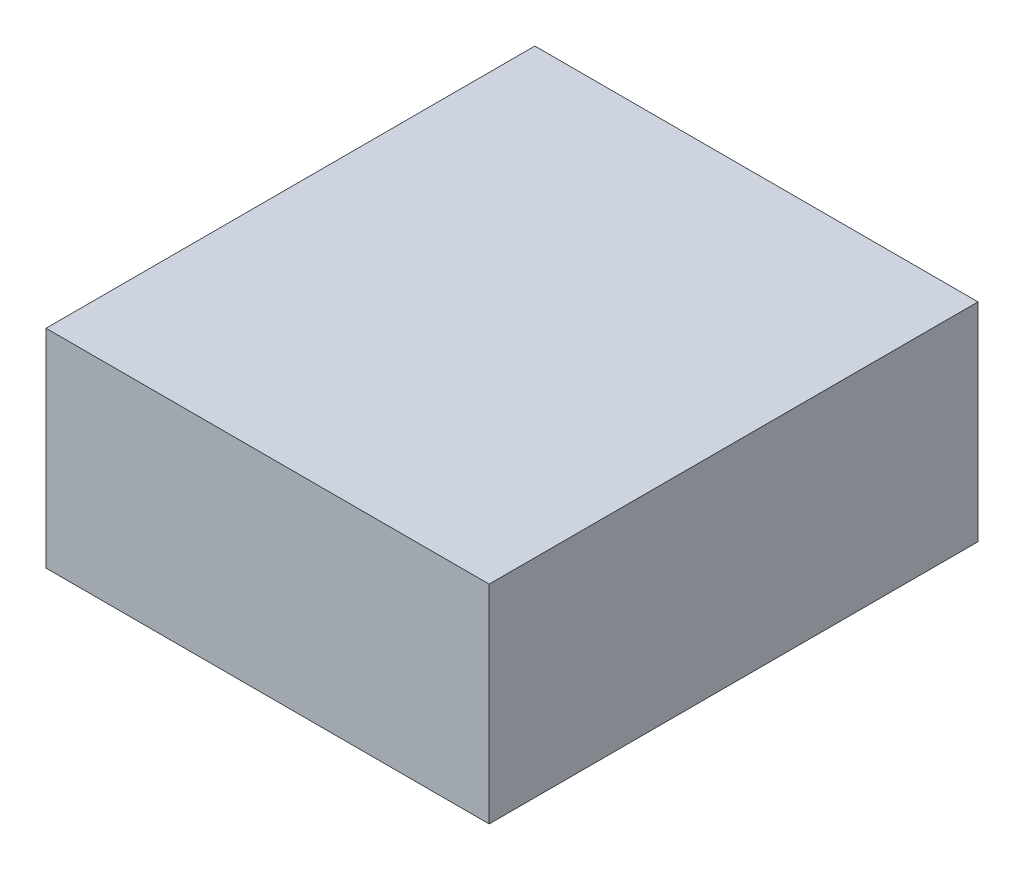
ISO-10303-21;
HEADER;
FILE_DESCRIPTION(('STEP AP214'),'2;1');
FILE_NAME('part.step','',(''),(''),'','','');
FILE_SCHEMA(('AUTOMOTIVE_DESIGN { 1 0 10303 214 1 1 1 1 }'));
ENDSEC;
DATA;
#1=APPLICATION_CONTEXT('core data for automotive mechanical design processes');
#2=APPLICATION_PROTOCOL_DEFINITION('international standard','automotive_design',2000,#1);
#3=PRODUCT_CONTEXT('',#1,'mechanical');
#4=PRODUCT('Part','Part','',(#3));
#5=PRODUCT_RELATED_PRODUCT_CATEGORY('part','',(#4));
#6=PRODUCT_DEFINITION_FORMATION('','',#4);
#7=PRODUCT_DEFINITION_CONTEXT('part definition',#1,'design');
#8=PRODUCT_DEFINITION('design','',#6,#7);
#9=PRODUCT_DEFINITION_SHAPE('','',#8);
#10=(LENGTH_UNIT() NAMED_UNIT(*) SI_UNIT(.MILLI.,.METRE.));
#11=(NAMED_UNIT(*) PLANE_ANGLE_UNIT() SI_UNIT($,.RADIAN.));
#12=(NAMED_UNIT(*) SI_UNIT($,.STERADIAN.) SOLID_ANGLE_UNIT());
#13=UNCERTAINTY_MEASURE_WITH_UNIT(LENGTH_MEASURE(1.E-05),#10,'distance_accuracy_value','');
#14=(GEOMETRIC_REPRESENTATION_CONTEXT(3) GLOBAL_UNCERTAINTY_ASSIGNED_CONTEXT((#13)) GLOBAL_UNIT_ASSIGNED_CONTEXT((#10,
#11,#12)) REPRESENTATION_CONTEXT('',''));
#15=CARTESIAN_POINT('',(0.,0.,0.));
#16=DIRECTION('',(0.,0.,1.));
#17=DIRECTION('',(1.,0.,0.));
#18=AXIS2_PLACEMENT_3D('',#15,#16,#17);
#19=CARTESIAN_POINT('',(32.,30.,-35.3));
#20=DIRECTION('',(-1.,0.,0.));
#21=DIRECTION('',(0.,0.,1.));
#22=AXIS2_PLACEMENT_3D('',#19,#20,#21);
#23=PLANE('',#22);
#24=DIRECTION('',(0.,0.,-1.));
#25=VECTOR('',#24,1.);
#26=CARTESIAN_POINT('',(32.,0.,-35.3));
#27=LINE('',#26,#25);
#28=CARTESIAN_POINT('',(32.,0.,35.3));
#29=VERTEX_POINT('',#28);
#30=CARTESIAN_POINT('',(32.,0.,-35.3));
#31=VERTEX_POINT('',#30);
#32=EDGE_CURVE('E117',#29,#31,#27,.T.);
#33=ORIENTED_EDGE('',*,*,#32,.T.);
#34=DIRECTION('',(0.,-1.,0.));
#35=VECTOR('',#34,1.);
#36=CARTESIAN_POINT('',(32.,30.,-35.3));
#37=LINE('',#36,#35);
#38=CARTESIAN_POINT('',(32.,30.,-35.3));
#39=VERTEX_POINT('',#38);
#40=EDGE_CURVE('E11',#39,#31,#37,.T.);
#41=ORIENTED_EDGE('',*,*,#40,.F.);
#42=DIRECTION('',(0.,0.,-1.));
#43=VECTOR('',#42,1.);
#44=CARTESIAN_POINT('',(32.,30.,-35.3));
#45=LINE('',#44,#43);
#46=CARTESIAN_POINT('',(32.,30.,35.3));
#47=VERTEX_POINT('',#46);
#48=EDGE_CURVE('E101',#47,#39,#45,.T.);
#49=ORIENTED_EDGE('',*,*,#48,.F.);
#50=DIRECTION('',(0.,-1.,0.));
#51=VECTOR('',#50,1.);
#52=CARTESIAN_POINT('',(32.,30.,35.3));
#53=LINE('',#52,#51);
#54=EDGE_CURVE('E113',#47,#29,#53,.T.);
#55=ORIENTED_EDGE('',*,*,#54,.T.);
#56=EDGE_LOOP('',(#33,#41,#49,#55));
#57=FACE_BOUND('',#56,.T.);
#58=ADVANCED_FACE('F49',(#57),#23,.F.);
#59=CARTESIAN_POINT('',(-32.,30.,-35.3));
#60=DIRECTION('',(0.,0.,1.));
#61=DIRECTION('',(1.,0.,0.));
#62=AXIS2_PLACEMENT_3D('',#59,#60,#61);
#63=PLANE('',#62);
#64=DIRECTION('',(-1.,0.,0.));
#65=VECTOR('',#64,1.);
#66=CARTESIAN_POINT('',(-32.,0.,-35.3));
#67=LINE('',#66,#65);
#68=CARTESIAN_POINT('',(-32.,0.,-35.3));
#69=VERTEX_POINT('',#68);
#70=EDGE_CURVE('E106',#31,#69,#67,.T.);
#71=ORIENTED_EDGE('',*,*,#70,.T.);
#72=DIRECTION('',(0.,-1.,0.));
#73=VECTOR('',#72,1.);
#74=CARTESIAN_POINT('',(-32.,30.,-35.3));
#75=LINE('',#74,#73);
#76=CARTESIAN_POINT('',(-32.,30.,-35.3));
#77=VERTEX_POINT('',#76);
#78=EDGE_CURVE('E58',#77,#69,#75,.T.);
#79=ORIENTED_EDGE('',*,*,#78,.F.);
#80=DIRECTION('',(-1.,0.,0.));
#81=VECTOR('',#80,1.);
#82=CARTESIAN_POINT('',(-32.,30.,-35.3));
#83=LINE('',#82,#81);
#84=EDGE_CURVE('E96',#39,#77,#83,.T.);
#85=ORIENTED_EDGE('',*,*,#84,.F.);
#86=ORIENTED_EDGE('',*,*,#40,.T.);
#87=EDGE_LOOP('',(#71,#79,#85,#86));
#88=FACE_BOUND('',#87,.T.);
#89=ADVANCED_FACE('F105',(#88),#63,.F.);
#90=CARTESIAN_POINT('',(-32.,30.,-35.3));
#91=DIRECTION('',(1.,0.,0.));
#92=DIRECTION('',(0.,0.,-1.));
#93=AXIS2_PLACEMENT_3D('',#90,#91,#92);
#94=PLANE('',#93);
#95=DIRECTION('',(0.,0.,1.));
#96=VECTOR('',#95,1.);
#97=CARTESIAN_POINT('',(-32.,0.,-35.3));
#98=LINE('',#97,#96);
#99=CARTESIAN_POINT('',(-32.,0.,35.3));
#100=VERTEX_POINT('',#99);
#101=EDGE_CURVE('E83',#69,#100,#98,.T.);
#102=ORIENTED_EDGE('',*,*,#101,.T.);
#103=DIRECTION('',(0.,-1.,0.));
#104=VECTOR('',#103,1.);
#105=CARTESIAN_POINT('',(-32.,30.,35.3));
#106=LINE('',#105,#104);
#107=CARTESIAN_POINT('',(-32.,30.,35.3));
#108=VERTEX_POINT('',#107);
#109=EDGE_CURVE('E108',#108,#100,#106,.T.);
#110=ORIENTED_EDGE('',*,*,#109,.F.);
#111=DIRECTION('',(0.,0.,1.));
#112=VECTOR('',#111,1.);
#113=CARTESIAN_POINT('',(-32.,30.,-35.3));
#114=LINE('',#113,#112);
#115=EDGE_CURVE('E99',#77,#108,#114,.T.);
#116=ORIENTED_EDGE('',*,*,#115,.F.);
#117=ORIENTED_EDGE('',*,*,#78,.T.);
#118=EDGE_LOOP('',(#102,#110,#116,#117));
#119=FACE_BOUND('',#118,.T.);
#120=ADVANCED_FACE('F109',(#119),#94,.F.);
#121=CARTESIAN_POINT('',(-32.,30.,35.3));
#122=DIRECTION('',(0.,0.,-1.));
#123=DIRECTION('',(-1.,0.,0.));
#124=AXIS2_PLACEMENT_3D('',#121,#122,#123);
#125=PLANE('',#124);
#126=DIRECTION('',(1.,0.,0.));
#127=VECTOR('',#126,1.);
#128=CARTESIAN_POINT('',(-32.,0.,35.3));
#129=LINE('',#128,#127);
#130=EDGE_CURVE('E89',#100,#29,#129,.T.);
#131=ORIENTED_EDGE('',*,*,#130,.T.);
#132=ORIENTED_EDGE('',*,*,#54,.F.);
#133=DIRECTION('',(1.,0.,0.));
#134=VECTOR('',#133,1.);
#135=CARTESIAN_POINT('',(-32.,30.,35.3));
#136=LINE('',#135,#134);
#137=EDGE_CURVE('E66',#108,#47,#136,.T.);
#138=ORIENTED_EDGE('',*,*,#137,.F.);
#139=ORIENTED_EDGE('',*,*,#109,.T.);
#140=EDGE_LOOP('',(#131,#132,#138,#139));
#141=FACE_BOUND('',#140,.T.);
#142=ADVANCED_FACE('F130',(#141),#125,.F.);
#143=CARTESIAN_POINT('',(0.,30.,0.));
#144=DIRECTION('',(0.,1.,0.));
#145=DIRECTION('',(0.,0.,1.));
#146=AXIS2_PLACEMENT_3D('',#143,#144,#145);
#147=PLANE('',#146);
#148=ORIENTED_EDGE('',*,*,#48,.T.);
#149=ORIENTED_EDGE('',*,*,#84,.T.);
#150=ORIENTED_EDGE('',*,*,#115,.T.);
#151=ORIENTED_EDGE('',*,*,#137,.T.);
#152=EDGE_LOOP('',(#148,#149,#150,#151));
#153=FACE_BOUND('',#152,.T.);
#154=ADVANCED_FACE('F97',(#153),#147,.T.);
#155=CARTESIAN_POINT('',(0.,0.,0.));
#156=DIRECTION('',(0.,1.,0.));
#157=DIRECTION('',(0.,0.,1.));
#158=AXIS2_PLACEMENT_3D('',#155,#156,#157);
#159=PLANE('',#158);
#160=ORIENTED_EDGE('',*,*,#32,.F.);
#161=ORIENTED_EDGE('',*,*,#130,.F.);
#162=ORIENTED_EDGE('',*,*,#101,.F.);
#163=ORIENTED_EDGE('',*,*,#70,.F.);
#164=EDGE_LOOP('',(#160,#161,#162,#163));
#165=FACE_BOUND('',#164,.T.);
#166=ADVANCED_FACE('F133',(#165),#159,.F.);
#167=CLOSED_SHELL('',(#58,#89,#120,#142,#154,#166));
#168=MANIFOLD_SOLID_BREP('B2',#167);
#169=ADVANCED_BREP_SHAPE_REPRESENTATION('',(#18,#168),#14);
#170=SHAPE_DEFINITION_REPRESENTATION(#9,#169);
ENDSEC;
END-ISO-10303-21;
